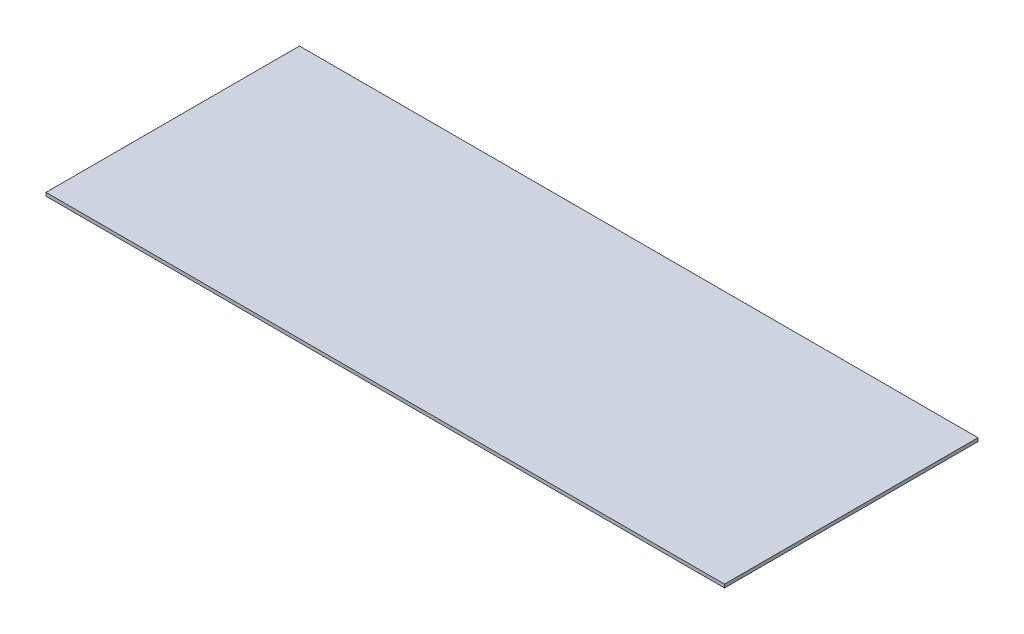
ISO-10303-21;
HEADER;
FILE_DESCRIPTION(('STEP AP214'),'2;1');
FILE_NAME('part.step','',(''),(''),'','','');
FILE_SCHEMA(('AUTOMOTIVE_DESIGN { 1 0 10303 214 1 1 1 1 }'));
ENDSEC;
DATA;
#1=APPLICATION_CONTEXT('core data for automotive mechanical design processes');
#2=APPLICATION_PROTOCOL_DEFINITION('international standard','automotive_design',2000,#1);
#3=PRODUCT_CONTEXT('',#1,'mechanical');
#4=PRODUCT('Part','Part','',(#3));
#5=PRODUCT_RELATED_PRODUCT_CATEGORY('part','',(#4));
#6=PRODUCT_DEFINITION_FORMATION('','',#4);
#7=PRODUCT_DEFINITION_CONTEXT('part definition',#1,'design');
#8=PRODUCT_DEFINITION('design','',#6,#7);
#9=PRODUCT_DEFINITION_SHAPE('','',#8);
#10=(LENGTH_UNIT() NAMED_UNIT(*) SI_UNIT(.MILLI.,.METRE.));
#11=(NAMED_UNIT(*) PLANE_ANGLE_UNIT() SI_UNIT($,.RADIAN.));
#12=(NAMED_UNIT(*) SI_UNIT($,.STERADIAN.) SOLID_ANGLE_UNIT());
#13=UNCERTAINTY_MEASURE_WITH_UNIT(LENGTH_MEASURE(1.E-05),#10,'distance_accuracy_value','');
#14=(GEOMETRIC_REPRESENTATION_CONTEXT(3) GLOBAL_UNCERTAINTY_ASSIGNED_CONTEXT((#13)) GLOBAL_UNIT_ASSIGNED_CONTEXT((#10,
#11,#12)) REPRESENTATION_CONTEXT('',''));
#15=CARTESIAN_POINT('',(0.,0.,0.));
#16=DIRECTION('',(0.,0.,1.));
#17=DIRECTION('',(1.,0.,0.));
#18=AXIS2_PLACEMENT_3D('',#15,#16,#17);
#19=CARTESIAN_POINT('',(-401.5,4.00000000000011,300.));
#20=DIRECTION('',(1.,0.,0.));
#21=DIRECTION('',(0.,0.,-1.));
#22=AXIS2_PLACEMENT_3D('',#19,#20,#21);
#23=PLANE('',#22);
#24=DIRECTION('',(0.,-1.,0.));
#25=VECTOR('',#24,1.);
#26=CARTESIAN_POINT('',(-401.5,4.00000000000011,0.));
#27=LINE('',#26,#25);
#28=CARTESIAN_POINT('',(-401.5,4.00000000000011,0.));
#29=VERTEX_POINT('',#28);
#30=CARTESIAN_POINT('',(-401.5,1.07392515297391E-13,0.));
#31=VERTEX_POINT('',#30);
#32=EDGE_CURVE('E96',#29,#31,#27,.T.);
#33=ORIENTED_EDGE('',*,*,#32,.T.);
#34=DIRECTION('',(0.,0.,-1.));
#35=VECTOR('',#34,1.);
#36=CARTESIAN_POINT('',(-401.5,1.07392515297391E-13,300.));
#37=LINE('',#36,#35);
#38=CARTESIAN_POINT('',(-401.5,1.07392515297391E-13,300.));
#39=VERTEX_POINT('',#38);
#40=EDGE_CURVE('E11',#39,#31,#37,.T.);
#41=ORIENTED_EDGE('',*,*,#40,.F.);
#42=DIRECTION('',(0.,-1.,0.));
#43=VECTOR('',#42,1.);
#44=CARTESIAN_POINT('',(-401.5,4.00000000000011,300.));
#45=LINE('',#44,#43);
#46=CARTESIAN_POINT('',(-401.5,4.00000000000011,300.));
#47=VERTEX_POINT('',#46);
#48=EDGE_CURVE('E84',#47,#39,#45,.T.);
#49=ORIENTED_EDGE('',*,*,#48,.F.);
#50=DIRECTION('',(0.,0.,-1.));
#51=VECTOR('',#50,1.);
#52=CARTESIAN_POINT('',(-401.5,4.00000000000011,300.));
#53=LINE('',#52,#51);
#54=EDGE_CURVE('E92',#47,#29,#53,.T.);
#55=ORIENTED_EDGE('',*,*,#54,.T.);
#56=EDGE_LOOP('',(#33,#41,#49,#55));
#57=FACE_BOUND('',#56,.T.);
#58=ADVANCED_FACE('F33',(#57),#23,.F.);
#59=CARTESIAN_POINT('',(401.5,2.05731653268924E-13,300.));
#60=DIRECTION('',(0.,1.,0.));
#61=DIRECTION('',(-1.,0.,0.));
#62=AXIS2_PLACEMENT_3D('',#59,#60,#61);
#63=PLANE('',#62);
#64=DIRECTION('',(1.,0.,0.));
#65=VECTOR('',#64,1.);
#66=CARTESIAN_POINT('',(401.5,2.05731653268924E-13,0.));
#67=LINE('',#66,#65);
#68=CARTESIAN_POINT('',(401.5,2.05731653268924E-13,0.));
#69=VERTEX_POINT('',#68);
#70=EDGE_CURVE('E88',#31,#69,#67,.T.);
#71=ORIENTED_EDGE('',*,*,#70,.T.);
#72=DIRECTION('',(0.,0.,-1.));
#73=VECTOR('',#72,1.);
#74=CARTESIAN_POINT('',(401.5,2.05731653268924E-13,300.));
#75=LINE('',#74,#73);
#76=CARTESIAN_POINT('',(401.5,2.05731653268924E-13,300.));
#77=VERTEX_POINT('',#76);
#78=EDGE_CURVE('E41',#77,#69,#75,.T.);
#79=ORIENTED_EDGE('',*,*,#78,.F.);
#80=DIRECTION('',(1.,0.,0.));
#81=VECTOR('',#80,1.);
#82=CARTESIAN_POINT('',(401.5,2.05731653268924E-13,300.));
#83=LINE('',#82,#81);
#84=EDGE_CURVE('E79',#39,#77,#83,.T.);
#85=ORIENTED_EDGE('',*,*,#84,.F.);
#86=ORIENTED_EDGE('',*,*,#40,.T.);
#87=EDGE_LOOP('',(#71,#79,#85,#86));
#88=FACE_BOUND('',#87,.T.);
#89=ADVANCED_FACE('F87',(#88),#63,.F.);
#90=CARTESIAN_POINT('',(401.5,2.05731653268924E-13,300.));
#91=DIRECTION('',(-1.,0.,0.));
#92=DIRECTION('',(0.,0.,1.));
#93=AXIS2_PLACEMENT_3D('',#90,#91,#92);
#94=PLANE('',#93);
#95=DIRECTION('',(0.,1.,0.));
#96=VECTOR('',#95,1.);
#97=CARTESIAN_POINT('',(401.5,2.05731653268924E-13,0.));
#98=LINE('',#97,#96);
#99=CARTESIAN_POINT('',(401.5,4.00000000000021,0.));
#100=VERTEX_POINT('',#99);
#101=EDGE_CURVE('E66',#69,#100,#98,.T.);
#102=ORIENTED_EDGE('',*,*,#101,.T.);
#103=DIRECTION('',(0.,0.,-1.));
#104=VECTOR('',#103,1.);
#105=CARTESIAN_POINT('',(401.5,4.00000000000021,300.));
#106=LINE('',#105,#104);
#107=CARTESIAN_POINT('',(401.5,4.00000000000021,300.));
#108=VERTEX_POINT('',#107);
#109=EDGE_CURVE('E89',#108,#100,#106,.T.);
#110=ORIENTED_EDGE('',*,*,#109,.F.);
#111=DIRECTION('',(0.,1.,0.));
#112=VECTOR('',#111,1.);
#113=CARTESIAN_POINT('',(401.5,2.05731653268924E-13,300.));
#114=LINE('',#113,#112);
#115=EDGE_CURVE('E82',#77,#108,#114,.T.);
#116=ORIENTED_EDGE('',*,*,#115,.F.);
#117=ORIENTED_EDGE('',*,*,#78,.T.);
#118=EDGE_LOOP('',(#102,#110,#116,#117));
#119=FACE_BOUND('',#118,.T.);
#120=ADVANCED_FACE('F90',(#119),#94,.F.);
#121=CARTESIAN_POINT('',(401.5,4.00000000000021,300.));
#122=DIRECTION('',(0.,-1.,0.));
#123=DIRECTION('',(1.,0.,0.));
#124=AXIS2_PLACEMENT_3D('',#121,#122,#123);
#125=PLANE('',#124);
#126=DIRECTION('',(-1.,0.,0.));
#127=VECTOR('',#126,1.);
#128=CARTESIAN_POINT('',(401.5,4.00000000000021,0.));
#129=LINE('',#128,#127);
#130=EDGE_CURVE('E72',#100,#29,#129,.T.);
#131=ORIENTED_EDGE('',*,*,#130,.T.);
#132=ORIENTED_EDGE('',*,*,#54,.F.);
#133=DIRECTION('',(-1.,0.,0.));
#134=VECTOR('',#133,1.);
#135=CARTESIAN_POINT('',(401.5,4.00000000000021,300.));
#136=LINE('',#135,#134);
#137=EDGE_CURVE('E49',#108,#47,#136,.T.);
#138=ORIENTED_EDGE('',*,*,#137,.F.);
#139=ORIENTED_EDGE('',*,*,#109,.T.);
#140=EDGE_LOOP('',(#131,#132,#138,#139));
#141=FACE_BOUND('',#140,.T.);
#142=ADVANCED_FACE('F103',(#141),#125,.F.);
#143=CARTESIAN_POINT('',(0.,0.,300.));
#144=DIRECTION('',(0.,0.,-1.));
#145=DIRECTION('',(-1.,0.,0.));
#146=AXIS2_PLACEMENT_3D('',#143,#144,#145);
#147=PLANE('',#146);
#148=ORIENTED_EDGE('',*,*,#48,.T.);
#149=ORIENTED_EDGE('',*,*,#84,.T.);
#150=ORIENTED_EDGE('',*,*,#115,.T.);
#151=ORIENTED_EDGE('',*,*,#137,.T.);
#152=EDGE_LOOP('',(#148,#149,#150,#151));
#153=FACE_BOUND('',#152,.T.);
#154=ADVANCED_FACE('F80',(#153),#147,.F.);
#155=CARTESIAN_POINT('',(0.,0.,0.));
#156=DIRECTION('',(0.,0.,-1.));
#157=DIRECTION('',(-1.,0.,0.));
#158=AXIS2_PLACEMENT_3D('',#155,#156,#157);
#159=PLANE('',#158);
#160=ORIENTED_EDGE('',*,*,#32,.F.);
#161=ORIENTED_EDGE('',*,*,#130,.F.);
#162=ORIENTED_EDGE('',*,*,#101,.F.);
#163=ORIENTED_EDGE('',*,*,#70,.F.);
#164=EDGE_LOOP('',(#160,#161,#162,#163));
#165=FACE_BOUND('',#164,.T.);
#166=ADVANCED_FACE('F106',(#165),#159,.T.);
#167=CLOSED_SHELL('',(#58,#89,#120,#142,#154,#166));
#168=MANIFOLD_SOLID_BREP('B2',#167);
#169=ADVANCED_BREP_SHAPE_REPRESENTATION('',(#18,#168),#14);
#170=SHAPE_DEFINITION_REPRESENTATION(#9,#169);
ENDSEC;
END-ISO-10303-21;
